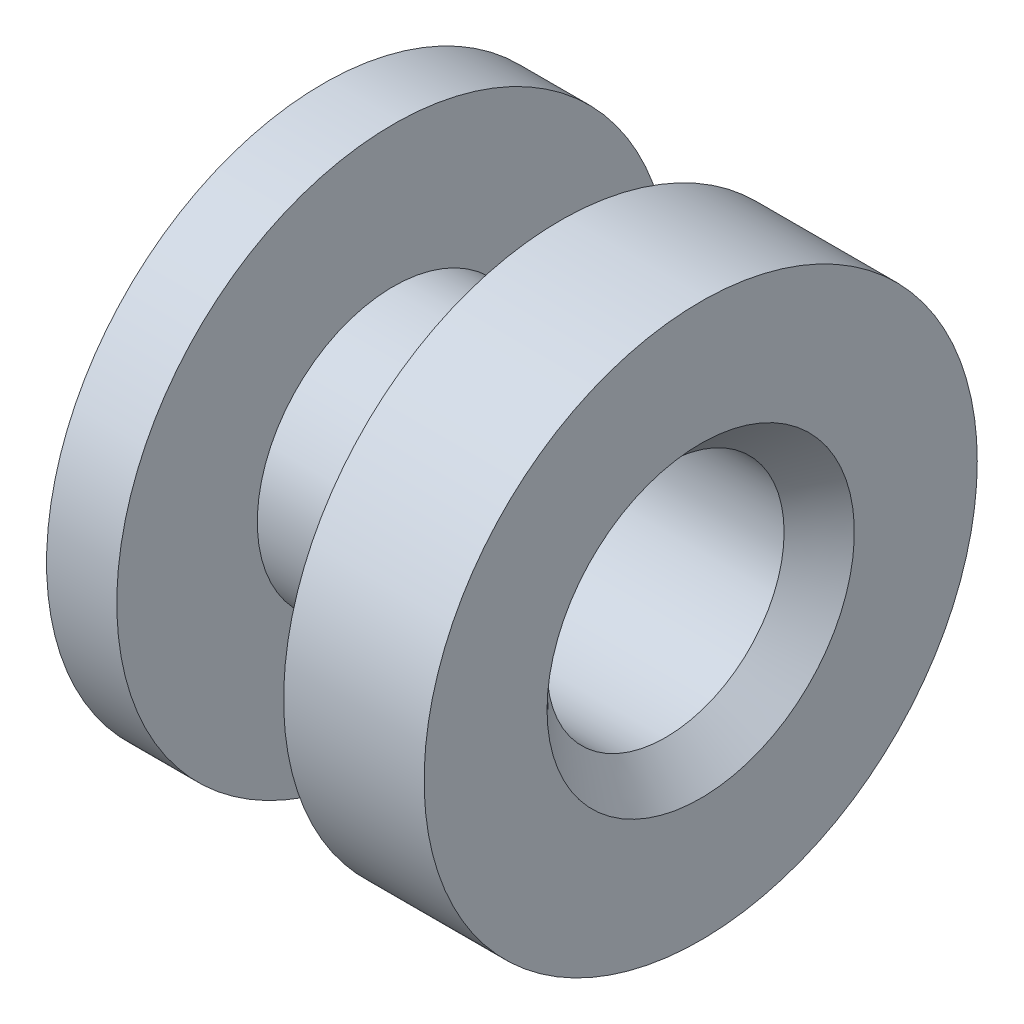
ISO-10303-21;
HEADER;
FILE_DESCRIPTION(('STEP AP214'),'2;1');
FILE_NAME('part.step','',(''),(''),'','','');
FILE_SCHEMA(('AUTOMOTIVE_DESIGN { 1 0 10303 214 1 1 1 1 }'));
ENDSEC;
DATA;
#1=APPLICATION_CONTEXT('core data for automotive mechanical design processes');
#2=APPLICATION_PROTOCOL_DEFINITION('international standard','automotive_design',2000,#1);
#3=PRODUCT_CONTEXT('',#1,'mechanical');
#4=PRODUCT('Part','Part','',(#3));
#5=PRODUCT_RELATED_PRODUCT_CATEGORY('part','',(#4));
#6=PRODUCT_DEFINITION_FORMATION('','',#4);
#7=PRODUCT_DEFINITION_CONTEXT('part definition',#1,'design');
#8=PRODUCT_DEFINITION('design','',#6,#7);
#9=PRODUCT_DEFINITION_SHAPE('','',#8);
#10=(LENGTH_UNIT() NAMED_UNIT(*) SI_UNIT(.MILLI.,.METRE.));
#11=(NAMED_UNIT(*) PLANE_ANGLE_UNIT() SI_UNIT($,.RADIAN.));
#12=(NAMED_UNIT(*) SI_UNIT($,.STERADIAN.) SOLID_ANGLE_UNIT());
#13=UNCERTAINTY_MEASURE_WITH_UNIT(LENGTH_MEASURE(1.E-05),#10,'distance_accuracy_value','');
#14=(GEOMETRIC_REPRESENTATION_CONTEXT(3) GLOBAL_UNCERTAINTY_ASSIGNED_CONTEXT((#13)) GLOBAL_UNIT_ASSIGNED_CONTEXT((#10,
#11,#12)) REPRESENTATION_CONTEXT('',''));
#15=CARTESIAN_POINT('',(0.,0.,0.));
#16=DIRECTION('',(0.,0.,1.));
#17=DIRECTION('',(1.,0.,0.));
#18=AXIS2_PLACEMENT_3D('',#15,#16,#17);
#19=CARTESIAN_POINT('',(10.922,0.,0.));
#20=DIRECTION('',(-1.,0.,0.));
#21=DIRECTION('',(0.,0.,1.));
#22=AXIS2_PLACEMENT_3D('',#19,#20,#21);
#23=PLANE('',#22);
#24=CARTESIAN_POINT('',(10.922,0.,0.));
#25=DIRECTION('',(-1.,0.,0.));
#26=DIRECTION('',(0.,0.,1.));
#27=AXIS2_PLACEMENT_3D('',#24,#25,#26);
#28=CIRCLE('',#27,4.44500000000001);
#29=CARTESIAN_POINT('',(10.922,0.,4.44500000000001));
#30=VERTEX_POINT('',#29);
#31=EDGE_CURVE('E10',#30,#30,#28,.T.);
#32=ORIENTED_EDGE('',*,*,#31,.T.);
#33=EDGE_LOOP('',(#32));
#34=FACE_BOUND('',#33,.T.);
#35=CARTESIAN_POINT('',(10.922,0.,0.));
#36=DIRECTION('',(1.,0.,0.));
#37=DIRECTION('',(0.,0.,-1.));
#38=AXIS2_PLACEMENT_3D('',#35,#36,#37);
#39=CIRCLE('',#38,8.001);
#40=CARTESIAN_POINT('',(10.922,0.,-8.001));
#41=VERTEX_POINT('',#40);
#42=EDGE_CURVE('E48',#41,#41,#39,.T.);
#43=ORIENTED_EDGE('',*,*,#42,.T.);
#44=EDGE_LOOP('',(#43));
#45=FACE_BOUND('',#44,.T.);
#46=ADVANCED_FACE('F36',(#34,#45),#23,.F.);
#47=CARTESIAN_POINT('',(10.922,0.,0.));
#48=DIRECTION('',(1.,0.,0.));
#49=DIRECTION('',(0.,0.,-1.));
#50=AXIS2_PLACEMENT_3D('',#47,#48,#49);
#51=CYLINDRICAL_SURFACE('',#50,8.001);
#52=ORIENTED_EDGE('',*,*,#42,.F.);
#53=EDGE_LOOP('',(#52));
#54=FACE_BOUND('',#53,.T.);
#55=CARTESIAN_POINT('',(6.858,0.,0.));
#56=DIRECTION('',(1.,0.,0.));
#57=DIRECTION('',(0.,0.,-1.));
#58=AXIS2_PLACEMENT_3D('',#55,#56,#57);
#59=CIRCLE('',#58,8.001);
#60=CARTESIAN_POINT('',(6.858,0.,-8.001));
#61=VERTEX_POINT('',#60);
#62=EDGE_CURVE('E52',#61,#61,#59,.T.);
#63=ORIENTED_EDGE('',*,*,#62,.T.);
#64=EDGE_LOOP('',(#63));
#65=FACE_BOUND('',#64,.T.);
#66=ADVANCED_FACE('F87',(#54,#65),#51,.T.);
#67=CARTESIAN_POINT('',(6.858,0.,0.));
#68=DIRECTION('',(1.,0.,0.));
#69=DIRECTION('',(0.,0.,-1.));
#70=AXIS2_PLACEMENT_3D('',#67,#68,#69);
#71=PLANE('',#70);
#72=ORIENTED_EDGE('',*,*,#62,.F.);
#73=EDGE_LOOP('',(#72));
#74=FACE_BOUND('',#73,.T.);
#75=CARTESIAN_POINT('',(6.858,0.,0.));
#76=DIRECTION('',(1.,0.,0.));
#77=DIRECTION('',(0.,0.,-1.));
#78=AXIS2_PLACEMENT_3D('',#75,#76,#77);
#79=CIRCLE('',#78,3.937);
#80=CARTESIAN_POINT('',(6.858,0.,-3.937));
#81=VERTEX_POINT('',#80);
#82=EDGE_CURVE('E57',#81,#81,#79,.T.);
#83=ORIENTED_EDGE('',*,*,#82,.T.);
#84=EDGE_LOOP('',(#83));
#85=FACE_BOUND('',#84,.T.);
#86=ADVANCED_FACE('F91',(#74,#85),#71,.F.);
#87=CARTESIAN_POINT('',(10.922,0.,0.));
#88=DIRECTION('',(1.,0.,0.));
#89=DIRECTION('',(0.,0.,-1.));
#90=AXIS2_PLACEMENT_3D('',#87,#88,#89);
#91=CYLINDRICAL_SURFACE('',#90,3.937);
#92=ORIENTED_EDGE('',*,*,#82,.F.);
#93=EDGE_LOOP('',(#92));
#94=FACE_BOUND('',#93,.T.);
#95=CARTESIAN_POINT('',(2.032,0.,0.));
#96=DIRECTION('',(1.,0.,0.));
#97=DIRECTION('',(0.,0.,-1.));
#98=AXIS2_PLACEMENT_3D('',#95,#96,#97);
#99=CIRCLE('',#98,3.937);
#100=CARTESIAN_POINT('',(2.032,0.,-3.937));
#101=VERTEX_POINT('',#100);
#102=EDGE_CURVE('E60',#101,#101,#99,.T.);
#103=ORIENTED_EDGE('',*,*,#102,.T.);
#104=EDGE_LOOP('',(#103));
#105=FACE_BOUND('',#104,.T.);
#106=ADVANCED_FACE('F98',(#94,#105),#91,.T.);
#107=CARTESIAN_POINT('',(2.032,0.,0.));
#108=DIRECTION('',(-1.,0.,0.));
#109=DIRECTION('',(0.,0.,1.));
#110=AXIS2_PLACEMENT_3D('',#107,#108,#109);
#111=PLANE('',#110);
#112=ORIENTED_EDGE('',*,*,#102,.F.);
#113=EDGE_LOOP('',(#112));
#114=FACE_BOUND('',#113,.T.);
#115=CARTESIAN_POINT('',(2.032,0.,0.));
#116=DIRECTION('',(1.,0.,0.));
#117=DIRECTION('',(0.,0.,-1.));
#118=AXIS2_PLACEMENT_3D('',#115,#116,#117);
#119=CIRCLE('',#118,8.001);
#120=CARTESIAN_POINT('',(2.032,0.,-8.001));
#121=VERTEX_POINT('',#120);
#122=EDGE_CURVE('E63',#121,#121,#119,.T.);
#123=ORIENTED_EDGE('',*,*,#122,.T.);
#124=EDGE_LOOP('',(#123));
#125=FACE_BOUND('',#124,.T.);
#126=ADVANCED_FACE('F102',(#114,#125),#111,.F.);
#127=CARTESIAN_POINT('',(10.922,0.,0.));
#128=DIRECTION('',(1.,0.,0.));
#129=DIRECTION('',(0.,0.,-1.));
#130=AXIS2_PLACEMENT_3D('',#127,#128,#129);
#131=CYLINDRICAL_SURFACE('',#130,8.001);
#132=ORIENTED_EDGE('',*,*,#122,.F.);
#133=EDGE_LOOP('',(#132));
#134=FACE_BOUND('',#133,.T.);
#135=CARTESIAN_POINT('',(0.,0.,0.));
#136=DIRECTION('',(1.,0.,0.));
#137=DIRECTION('',(0.,0.,-1.));
#138=AXIS2_PLACEMENT_3D('',#135,#136,#137);
#139=CIRCLE('',#138,8.001);
#140=CARTESIAN_POINT('',(0.,0.,-8.001));
#141=VERTEX_POINT('',#140);
#142=EDGE_CURVE('E66',#141,#141,#139,.T.);
#143=ORIENTED_EDGE('',*,*,#142,.T.);
#144=EDGE_LOOP('',(#143));
#145=FACE_BOUND('',#144,.T.);
#146=ADVANCED_FACE('F84',(#134,#145),#131,.T.);
#147=CARTESIAN_POINT('',(0.,0.,0.));
#148=DIRECTION('',(1.,0.,0.));
#149=DIRECTION('',(0.,0.,-1.));
#150=AXIS2_PLACEMENT_3D('',#147,#148,#149);
#151=PLANE('',#150);
#152=CARTESIAN_POINT('',(0.,0.,0.));
#153=DIRECTION('',(1.,0.,0.));
#154=DIRECTION('',(0.,0.,-1.));
#155=AXIS2_PLACEMENT_3D('',#152,#153,#154);
#156=CIRCLE('',#155,3.429);
#157=CARTESIAN_POINT('',(0.,0.,-3.429));
#158=VERTEX_POINT('',#157);
#159=EDGE_CURVE('E69',#158,#158,#156,.T.);
#160=ORIENTED_EDGE('',*,*,#159,.T.);
#161=EDGE_LOOP('',(#160));
#162=FACE_BOUND('',#161,.T.);
#163=ORIENTED_EDGE('',*,*,#142,.F.);
#164=EDGE_LOOP('',(#163));
#165=FACE_BOUND('',#164,.T.);
#166=ADVANCED_FACE('F73',(#162,#165),#151,.F.);
#167=CARTESIAN_POINT('',(0.,0.,0.));
#168=DIRECTION('',(1.,0.,0.));
#169=DIRECTION('',(0.,0.,-1.));
#170=AXIS2_PLACEMENT_3D('',#167,#168,#169);
#171=CYLINDRICAL_SURFACE('',#170,3.429);
#172=CARTESIAN_POINT('',(9.90599999999999,0.,0.));
#173=DIRECTION('',(-1.,0.,0.));
#174=DIRECTION('',(0.,0.,1.));
#175=AXIS2_PLACEMENT_3D('',#172,#173,#174);
#176=CIRCLE('',#175,3.429);
#177=CARTESIAN_POINT('',(9.90599999999999,0.,3.429));
#178=VERTEX_POINT('',#177);
#179=EDGE_CURVE('E44',#178,#178,#176,.F.);
#180=ORIENTED_EDGE('',*,*,#179,.T.);
#181=EDGE_LOOP('',(#180));
#182=FACE_BOUND('',#181,.T.);
#183=ORIENTED_EDGE('',*,*,#159,.F.);
#184=EDGE_LOOP('',(#183));
#185=FACE_BOUND('',#184,.T.);
#186=ADVANCED_FACE('F76',(#182,#185),#171,.F.);
#187=CARTESIAN_POINT('',(9.90599999999999,0.,0.));
#188=DIRECTION('',(1.,0.,0.));
#189=DIRECTION('',(0.,0.,-1.));
#190=AXIS2_PLACEMENT_3D('',#187,#188,#189);
#191=CONICAL_SURFACE('',#190,3.429,0.785398163397449);
#192=ORIENTED_EDGE('',*,*,#31,.F.);
#193=EDGE_LOOP('',(#192));
#194=FACE_BOUND('',#193,.T.);
#195=ORIENTED_EDGE('',*,*,#179,.F.);
#196=EDGE_LOOP('',(#195));
#197=FACE_BOUND('',#196,.T.);
#198=ADVANCED_FACE('F39',(#194,#197),#191,.F.);
#199=CLOSED_SHELL('',(#46,#66,#86,#106,#126,#146,#166,#186,#198));
#200=MANIFOLD_SOLID_BREP('B2',#199);
#201=ADVANCED_BREP_SHAPE_REPRESENTATION('',(#18,#200),#14);
#202=SHAPE_DEFINITION_REPRESENTATION(#9,#201);
ENDSEC;
END-ISO-10303-21;
